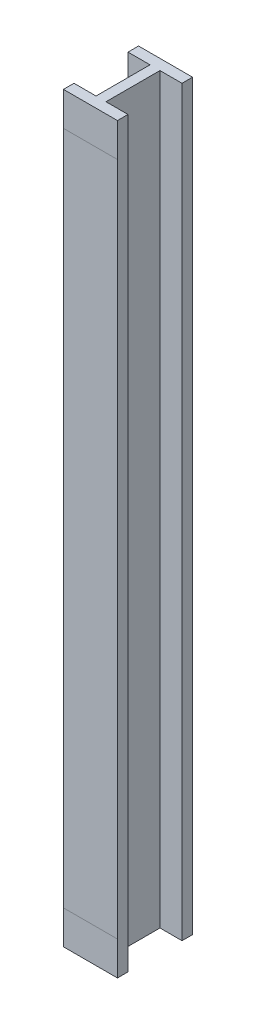
ISO-10303-21;
HEADER;
FILE_DESCRIPTION(('STEP AP214'),'2;1');
FILE_NAME('part.step','',(''),(''),'','','');
FILE_SCHEMA(('AUTOMOTIVE_DESIGN { 1 0 10303 214 1 1 1 1 }'));
ENDSEC;
DATA;
#1=APPLICATION_CONTEXT('core data for automotive mechanical design processes');
#2=APPLICATION_PROTOCOL_DEFINITION('international standard','automotive_design',2000,#1);
#3=PRODUCT_CONTEXT('',#1,'mechanical');
#4=PRODUCT('Part','Part','',(#3));
#5=PRODUCT_RELATED_PRODUCT_CATEGORY('part','',(#4));
#6=PRODUCT_DEFINITION_FORMATION('','',#4);
#7=PRODUCT_DEFINITION_CONTEXT('part definition',#1,'design');
#8=PRODUCT_DEFINITION('design','',#6,#7);
#9=PRODUCT_DEFINITION_SHAPE('','',#8);
#10=(LENGTH_UNIT() NAMED_UNIT(*) SI_UNIT(.MILLI.,.METRE.));
#11=(NAMED_UNIT(*) PLANE_ANGLE_UNIT() SI_UNIT($,.RADIAN.));
#12=(NAMED_UNIT(*) SI_UNIT($,.STERADIAN.) SOLID_ANGLE_UNIT());
#13=UNCERTAINTY_MEASURE_WITH_UNIT(LENGTH_MEASURE(1.E-05),#10,'distance_accuracy_value','');
#14=(GEOMETRIC_REPRESENTATION_CONTEXT(3) GLOBAL_UNCERTAINTY_ASSIGNED_CONTEXT((#13)) GLOBAL_UNIT_ASSIGNED_CONTEXT((#10,
#11,#12)) REPRESENTATION_CONTEXT('',''));
#15=CARTESIAN_POINT('',(0.,0.,0.));
#16=DIRECTION('',(0.,0.,1.));
#17=DIRECTION('',(1.,0.,0.));
#18=AXIS2_PLACEMENT_3D('',#15,#16,#17);
#19=CARTESIAN_POINT('',(0.,2200.,0.));
#20=DIRECTION('',(0.,0.,-1.));
#21=DIRECTION('',(-1.,0.,0.));
#22=AXIS2_PLACEMENT_3D('',#19,#20,#21);
#23=PLANE('',#22);
#24=DIRECTION('',(1.,0.,0.));
#25=VECTOR('',#24,1.);
#26=CARTESIAN_POINT('',(0.,100.,0.));
#27=LINE('',#26,#25);
#28=CARTESIAN_POINT('',(-80.,100.,0.));
#29=VERTEX_POINT('',#28);
#30=CARTESIAN_POINT('',(80.,100.,0.));
#31=VERTEX_POINT('',#30);
#32=EDGE_CURVE('E12',#29,#31,#27,.T.);
#33=ORIENTED_EDGE('',*,*,#32,.F.);
#34=DIRECTION('',(0.,-1.,0.));
#35=VECTOR('',#34,1.);
#36=CARTESIAN_POINT('',(-80.,2200.,0.));
#37=LINE('',#36,#35);
#38=CARTESIAN_POINT('',(-80.,0.,0.));
#39=VERTEX_POINT('',#38);
#40=EDGE_CURVE('E215',#29,#39,#37,.T.);
#41=ORIENTED_EDGE('',*,*,#40,.T.);
#42=DIRECTION('',(1.,0.,0.));
#43=VECTOR('',#42,1.);
#44=CARTESIAN_POINT('',(0.,0.,0.));
#45=LINE('',#44,#43);
#46=CARTESIAN_POINT('',(80.,0.,0.));
#47=VERTEX_POINT('',#46);
#48=EDGE_CURVE('E216',#39,#47,#45,.T.);
#49=ORIENTED_EDGE('',*,*,#48,.T.);
#50=DIRECTION('',(0.,-1.,0.));
#51=VECTOR('',#50,1.);
#52=CARTESIAN_POINT('',(80.,2200.,0.));
#53=LINE('',#52,#51);
#54=EDGE_CURVE('E176',#31,#47,#53,.T.);
#55=ORIENTED_EDGE('',*,*,#54,.F.);
#56=EDGE_LOOP('',(#33,#41,#49,#55));
#57=FACE_BOUND('',#56,.T.);
#58=ADVANCED_FACE('F53',(#57),#23,.F.);
#59=CARTESIAN_POINT('',(-80.,2100.,0.));
#60=VERTEX_POINT('',#59);
#61=EDGE_CURVE('E269',#60,#29,#37,.T.);
#62=ORIENTED_EDGE('',*,*,#61,.T.);
#63=ORIENTED_EDGE('',*,*,#32,.T.);
#64=CARTESIAN_POINT('',(80.,2100.,0.));
#65=VERTEX_POINT('',#64);
#66=EDGE_CURVE('E174',#65,#31,#53,.T.);
#67=ORIENTED_EDGE('',*,*,#66,.F.);
#68=DIRECTION('',(1.,0.,0.));
#69=VECTOR('',#68,1.);
#70=CARTESIAN_POINT('',(0.,2100.,0.));
#71=LINE('',#70,#69);
#72=EDGE_CURVE('E63',#60,#65,#71,.T.);
#73=ORIENTED_EDGE('',*,*,#72,.F.);
#74=EDGE_LOOP('',(#62,#63,#67,#73));
#75=FACE_BOUND('',#74,.T.);
#76=ADVANCED_FACE('F267',(#75),#23,.F.);
#77=CARTESIAN_POINT('',(-80.,2200.,0.));
#78=VERTEX_POINT('',#77);
#79=EDGE_CURVE('E274',#78,#60,#37,.T.);
#80=ORIENTED_EDGE('',*,*,#79,.T.);
#81=ORIENTED_EDGE('',*,*,#72,.T.);
#82=CARTESIAN_POINT('',(80.,2200.,0.));
#83=VERTEX_POINT('',#82);
#84=EDGE_CURVE('E170',#83,#65,#53,.T.);
#85=ORIENTED_EDGE('',*,*,#84,.F.);
#86=DIRECTION('',(1.,0.,0.));
#87=VECTOR('',#86,1.);
#88=CARTESIAN_POINT('',(-80.,2200.,0.));
#89=LINE('',#88,#87);
#90=EDGE_CURVE('E155',#78,#83,#89,.T.);
#91=ORIENTED_EDGE('',*,*,#90,.F.);
#92=EDGE_LOOP('',(#80,#81,#85,#91));
#93=FACE_BOUND('',#92,.T.);
#94=ADVANCED_FACE('F55',(#93),#23,.F.);
#95=CARTESIAN_POINT('',(80.,2200.,0.));
#96=DIRECTION('',(-1.,0.,0.));
#97=DIRECTION('',(0.,0.,1.));
#98=AXIS2_PLACEMENT_3D('',#95,#96,#97);
#99=PLANE('',#98);
#100=DIRECTION('',(0.,0.,-1.));
#101=VECTOR('',#100,1.);
#102=CARTESIAN_POINT('',(80.,0.,0.));
#103=LINE('',#102,#101);
#104=CARTESIAN_POINT('',(80.,0.,-31.25));
#105=VERTEX_POINT('',#104);
#106=EDGE_CURVE('E291',#47,#105,#103,.T.);
#107=ORIENTED_EDGE('',*,*,#106,.T.);
#108=DIRECTION('',(0.,-1.,0.));
#109=VECTOR('',#108,1.);
#110=CARTESIAN_POINT('',(80.,2200.,-31.25));
#111=LINE('',#110,#109);
#112=CARTESIAN_POINT('',(80.,2200.,-31.25));
#113=VERTEX_POINT('',#112);
#114=EDGE_CURVE('E179',#113,#105,#111,.T.);
#115=ORIENTED_EDGE('',*,*,#114,.F.);
#116=DIRECTION('',(0.,0.,-1.));
#117=VECTOR('',#116,1.);
#118=CARTESIAN_POINT('',(80.,2200.,0.));
#119=LINE('',#118,#117);
#120=EDGE_CURVE('E159',#83,#113,#119,.T.);
#121=ORIENTED_EDGE('',*,*,#120,.F.);
#122=ORIENTED_EDGE('',*,*,#84,.T.);
#123=ORIENTED_EDGE('',*,*,#66,.T.);
#124=ORIENTED_EDGE('',*,*,#54,.T.);
#125=EDGE_LOOP('',(#107,#115,#121,#122,#123,#124));
#126=FACE_BOUND('',#125,.T.);
#127=ADVANCED_FACE('F177',(#126),#99,.F.);
#128=CARTESIAN_POINT('',(80.,2200.,-31.25));
#129=DIRECTION('',(0.,0.,1.));
#130=DIRECTION('',(1.,0.,0.));
#131=AXIS2_PLACEMENT_3D('',#128,#129,#130);
#132=PLANE('',#131);
#133=DIRECTION('',(-1.,0.,0.));
#134=VECTOR('',#133,1.);
#135=CARTESIAN_POINT('',(80.,0.,-31.25));
#136=LINE('',#135,#134);
#137=CARTESIAN_POINT('',(14.7486033519554,0.,-31.25));
#138=VERTEX_POINT('',#137);
#139=EDGE_CURVE('E321',#105,#138,#136,.T.);
#140=ORIENTED_EDGE('',*,*,#139,.T.);
#141=DIRECTION('',(0.,-1.,0.));
#142=VECTOR('',#141,1.);
#143=CARTESIAN_POINT('',(14.7486033519554,2200.,-31.25));
#144=LINE('',#143,#142);
#145=CARTESIAN_POINT('',(14.7486033519554,2200.,-31.25));
#146=VERTEX_POINT('',#145);
#147=EDGE_CURVE('E254',#146,#138,#144,.T.);
#148=ORIENTED_EDGE('',*,*,#147,.F.);
#149=DIRECTION('',(-1.,0.,0.));
#150=VECTOR('',#149,1.);
#151=CARTESIAN_POINT('',(80.,2200.,-31.25));
#152=LINE('',#151,#150);
#153=EDGE_CURVE('E182',#113,#146,#152,.T.);
#154=ORIENTED_EDGE('',*,*,#153,.F.);
#155=ORIENTED_EDGE('',*,*,#114,.T.);
#156=EDGE_LOOP('',(#140,#148,#154,#155));
#157=FACE_BOUND('',#156,.T.);
#158=ADVANCED_FACE('F324',(#157),#132,.F.);
#159=CARTESIAN_POINT('',(14.7486033519554,2200.,-31.25));
#160=DIRECTION('',(-1.,0.,0.));
#161=DIRECTION('',(0.,0.,1.));
#162=AXIS2_PLACEMENT_3D('',#159,#160,#161);
#163=PLANE('',#162);
#164=DIRECTION('',(0.,0.,-1.));
#165=VECTOR('',#164,1.);
#166=CARTESIAN_POINT('',(14.7486033519554,0.,-31.25));
#167=LINE('',#166,#165);
#168=CARTESIAN_POINT('',(14.7486033519554,0.,-191.25));
#169=VERTEX_POINT('',#168);
#170=EDGE_CURVE('E318',#138,#169,#167,.T.);
#171=ORIENTED_EDGE('',*,*,#170,.T.);
#172=DIRECTION('',(0.,-1.,0.));
#173=VECTOR('',#172,1.);
#174=CARTESIAN_POINT('',(14.7486033519554,2200.,-191.25));
#175=LINE('',#174,#173);
#176=CARTESIAN_POINT('',(14.7486033519554,2200.,-191.25));
#177=VERTEX_POINT('',#176);
#178=EDGE_CURVE('E251',#177,#169,#175,.T.);
#179=ORIENTED_EDGE('',*,*,#178,.F.);
#180=DIRECTION('',(0.,0.,-1.));
#181=VECTOR('',#180,1.);
#182=CARTESIAN_POINT('',(14.7486033519554,2200.,-31.25));
#183=LINE('',#182,#181);
#184=EDGE_CURVE('E185',#146,#177,#183,.T.);
#185=ORIENTED_EDGE('',*,*,#184,.F.);
#186=ORIENTED_EDGE('',*,*,#147,.T.);
#187=EDGE_LOOP('',(#171,#179,#185,#186));
#188=FACE_BOUND('',#187,.T.);
#189=ADVANCED_FACE('F328',(#188),#163,.F.);
#190=CARTESIAN_POINT('',(14.7486033519554,2200.,-191.25));
#191=DIRECTION('',(0.,0.,-1.));
#192=DIRECTION('',(-1.,0.,0.));
#193=AXIS2_PLACEMENT_3D('',#190,#191,#192);
#194=PLANE('',#193);
#195=DIRECTION('',(1.,0.,0.));
#196=VECTOR('',#195,1.);
#197=CARTESIAN_POINT('',(14.7486033519554,0.,-191.25));
#198=LINE('',#197,#196);
#199=CARTESIAN_POINT('',(80.,0.,-191.25));
#200=VERTEX_POINT('',#199);
#201=EDGE_CURVE('E315',#169,#200,#198,.T.);
#202=ORIENTED_EDGE('',*,*,#201,.T.);
#203=DIRECTION('',(0.,-1.,0.));
#204=VECTOR('',#203,1.);
#205=CARTESIAN_POINT('',(80.,2200.,-191.25));
#206=LINE('',#205,#204);
#207=CARTESIAN_POINT('',(80.,2200.,-191.25));
#208=VERTEX_POINT('',#207);
#209=EDGE_CURVE('E247',#208,#200,#206,.T.);
#210=ORIENTED_EDGE('',*,*,#209,.F.);
#211=DIRECTION('',(1.,0.,0.));
#212=VECTOR('',#211,1.);
#213=CARTESIAN_POINT('',(14.7486033519554,2200.,-191.25));
#214=LINE('',#213,#212);
#215=EDGE_CURVE('E191',#177,#208,#214,.T.);
#216=ORIENTED_EDGE('',*,*,#215,.F.);
#217=ORIENTED_EDGE('',*,*,#178,.T.);
#218=EDGE_LOOP('',(#202,#210,#216,#217));
#219=FACE_BOUND('',#218,.T.);
#220=ADVANCED_FACE('F331',(#219),#194,.F.);
#221=CARTESIAN_POINT('',(80.,2200.,-191.25));
#222=DIRECTION('',(-1.,0.,0.));
#223=DIRECTION('',(0.,0.,1.));
#224=AXIS2_PLACEMENT_3D('',#221,#222,#223);
#225=PLANE('',#224);
#226=DIRECTION('',(0.,0.,-1.));
#227=VECTOR('',#226,1.);
#228=CARTESIAN_POINT('',(80.,0.,-191.25));
#229=LINE('',#228,#227);
#230=CARTESIAN_POINT('',(80.,0.,-222.5));
#231=VERTEX_POINT('',#230);
#232=EDGE_CURVE('E312',#200,#231,#229,.T.);
#233=ORIENTED_EDGE('',*,*,#232,.T.);
#234=DIRECTION('',(0.,-1.,0.));
#235=VECTOR('',#234,1.);
#236=CARTESIAN_POINT('',(80.,2200.,-222.5));
#237=LINE('',#236,#235);
#238=CARTESIAN_POINT('',(80.,2200.,-222.5));
#239=VERTEX_POINT('',#238);
#240=EDGE_CURVE('E241',#239,#231,#237,.T.);
#241=ORIENTED_EDGE('',*,*,#240,.F.);
#242=DIRECTION('',(0.,0.,-1.));
#243=VECTOR('',#242,1.);
#244=CARTESIAN_POINT('',(80.,2200.,-191.25));
#245=LINE('',#244,#243);
#246=EDGE_CURVE('E194',#208,#239,#245,.T.);
#247=ORIENTED_EDGE('',*,*,#246,.F.);
#248=ORIENTED_EDGE('',*,*,#209,.T.);
#249=EDGE_LOOP('',(#233,#241,#247,#248));
#250=FACE_BOUND('',#249,.T.);
#251=ADVANCED_FACE('F338',(#250),#225,.F.);
#252=CARTESIAN_POINT('',(80.,2200.,-222.5));
#253=DIRECTION('',(0.,0.,1.));
#254=DIRECTION('',(1.,0.,0.));
#255=AXIS2_PLACEMENT_3D('',#252,#253,#254);
#256=PLANE('',#255);
#257=DIRECTION('',(-1.,0.,0.));
#258=VECTOR('',#257,1.);
#259=CARTESIAN_POINT('',(80.,0.,-222.5));
#260=LINE('',#259,#258);
#261=CARTESIAN_POINT('',(-80.,0.,-222.5));
#262=VERTEX_POINT('',#261);
#263=EDGE_CURVE('E309',#231,#262,#260,.T.);
#264=ORIENTED_EDGE('',*,*,#263,.T.);
#265=DIRECTION('',(0.,-1.,0.));
#266=VECTOR('',#265,1.);
#267=CARTESIAN_POINT('',(-80.,2200.,-222.5));
#268=LINE('',#267,#266);
#269=CARTESIAN_POINT('',(-80.,2200.,-222.5));
#270=VERTEX_POINT('',#269);
#271=EDGE_CURVE('E236',#270,#262,#268,.T.);
#272=ORIENTED_EDGE('',*,*,#271,.F.);
#273=DIRECTION('',(-1.,0.,0.));
#274=VECTOR('',#273,1.);
#275=CARTESIAN_POINT('',(80.,2200.,-222.5));
#276=LINE('',#275,#274);
#277=EDGE_CURVE('E197',#239,#270,#276,.T.);
#278=ORIENTED_EDGE('',*,*,#277,.F.);
#279=ORIENTED_EDGE('',*,*,#240,.T.);
#280=EDGE_LOOP('',(#264,#272,#278,#279));
#281=FACE_BOUND('',#280,.T.);
#282=ADVANCED_FACE('F341',(#281),#256,.F.);
#283=CARTESIAN_POINT('',(-80.,2200.,-222.5));
#284=DIRECTION('',(1.,0.,0.));
#285=DIRECTION('',(0.,0.,-1.));
#286=AXIS2_PLACEMENT_3D('',#283,#284,#285);
#287=PLANE('',#286);
#288=DIRECTION('',(0.,0.,1.));
#289=VECTOR('',#288,1.);
#290=CARTESIAN_POINT('',(-80.,0.,-222.5));
#291=LINE('',#290,#289);
#292=CARTESIAN_POINT('',(-80.,0.,-191.25));
#293=VERTEX_POINT('',#292);
#294=EDGE_CURVE('E306',#262,#293,#291,.T.);
#295=ORIENTED_EDGE('',*,*,#294,.T.);
#296=DIRECTION('',(0.,-1.,0.));
#297=VECTOR('',#296,1.);
#298=CARTESIAN_POINT('',(-80.,2200.,-191.25));
#299=LINE('',#298,#297);
#300=CARTESIAN_POINT('',(-80.,2200.,-191.25));
#301=VERTEX_POINT('',#300);
#302=EDGE_CURVE('E242',#301,#293,#299,.T.);
#303=ORIENTED_EDGE('',*,*,#302,.F.);
#304=DIRECTION('',(0.,0.,1.));
#305=VECTOR('',#304,1.);
#306=CARTESIAN_POINT('',(-80.,2200.,-222.5));
#307=LINE('',#306,#305);
#308=EDGE_CURVE('E200',#270,#301,#307,.T.);
#309=ORIENTED_EDGE('',*,*,#308,.F.);
#310=ORIENTED_EDGE('',*,*,#271,.T.);
#311=EDGE_LOOP('',(#295,#303,#309,#310));
#312=FACE_BOUND('',#311,.T.);
#313=ADVANCED_FACE('F346',(#312),#287,.F.);
#314=CARTESIAN_POINT('',(-80.,2200.,-191.25));
#315=DIRECTION('',(0.,0.,-1.));
#316=DIRECTION('',(-1.,0.,0.));
#317=AXIS2_PLACEMENT_3D('',#314,#315,#316);
#318=PLANE('',#317);
#319=DIRECTION('',(1.,0.,0.));
#320=VECTOR('',#319,1.);
#321=CARTESIAN_POINT('',(-80.,0.,-191.25));
#322=LINE('',#321,#320);
#323=CARTESIAN_POINT('',(-14.7486033519554,0.,-191.25));
#324=VERTEX_POINT('',#323);
#325=EDGE_CURVE('E303',#293,#324,#322,.T.);
#326=ORIENTED_EDGE('',*,*,#325,.T.);
#327=DIRECTION('',(0.,-1.,0.));
#328=VECTOR('',#327,1.);
#329=CARTESIAN_POINT('',(-14.7486033519554,2200.,-191.25));
#330=LINE('',#329,#328);
#331=CARTESIAN_POINT('',(-14.7486033519554,2200.,-191.25));
#332=VERTEX_POINT('',#331);
#333=EDGE_CURVE('E354',#332,#324,#330,.T.);
#334=ORIENTED_EDGE('',*,*,#333,.F.);
#335=DIRECTION('',(1.,0.,0.));
#336=VECTOR('',#335,1.);
#337=CARTESIAN_POINT('',(-80.,2200.,-191.25));
#338=LINE('',#337,#336);
#339=EDGE_CURVE('E203',#301,#332,#338,.T.);
#340=ORIENTED_EDGE('',*,*,#339,.F.);
#341=ORIENTED_EDGE('',*,*,#302,.T.);
#342=EDGE_LOOP('',(#326,#334,#340,#341));
#343=FACE_BOUND('',#342,.T.);
#344=ADVANCED_FACE('F355',(#343),#318,.F.);
#345=CARTESIAN_POINT('',(-14.7486033519554,2200.,-191.25));
#346=DIRECTION('',(1.,0.,0.));
#347=DIRECTION('',(0.,0.,-1.));
#348=AXIS2_PLACEMENT_3D('',#345,#346,#347);
#349=PLANE('',#348);
#350=DIRECTION('',(0.,0.,1.));
#351=VECTOR('',#350,1.);
#352=CARTESIAN_POINT('',(-14.7486033519554,0.,-191.25));
#353=LINE('',#352,#351);
#354=CARTESIAN_POINT('',(-14.7486033519554,0.,-31.25));
#355=VERTEX_POINT('',#354);
#356=EDGE_CURVE('E297',#324,#355,#353,.T.);
#357=ORIENTED_EDGE('',*,*,#356,.T.);
#358=DIRECTION('',(0.,-1.,0.));
#359=VECTOR('',#358,1.);
#360=CARTESIAN_POINT('',(-14.7486033519554,2200.,-31.25));
#361=LINE('',#360,#359);
#362=CARTESIAN_POINT('',(-14.7486033519554,2200.,-31.25));
#363=VERTEX_POINT('',#362);
#364=EDGE_CURVE('E281',#363,#355,#361,.T.);
#365=ORIENTED_EDGE('',*,*,#364,.F.);
#366=DIRECTION('',(0.,0.,1.));
#367=VECTOR('',#366,1.);
#368=CARTESIAN_POINT('',(-14.7486033519554,2200.,-191.25));
#369=LINE('',#368,#367);
#370=EDGE_CURVE('E206',#332,#363,#369,.T.);
#371=ORIENTED_EDGE('',*,*,#370,.F.);
#372=ORIENTED_EDGE('',*,*,#333,.T.);
#373=EDGE_LOOP('',(#357,#365,#371,#372));
#374=FACE_BOUND('',#373,.T.);
#375=ADVANCED_FACE('F360',(#374),#349,.F.);
#376=CARTESIAN_POINT('',(-14.7486033519554,2200.,-31.25));
#377=DIRECTION('',(0.,0.,1.));
#378=DIRECTION('',(1.,0.,0.));
#379=AXIS2_PLACEMENT_3D('',#376,#377,#378);
#380=PLANE('',#379);
#381=DIRECTION('',(-1.,0.,0.));
#382=VECTOR('',#381,1.);
#383=CARTESIAN_POINT('',(-14.7486033519554,0.,-31.25));
#384=LINE('',#383,#382);
#385=CARTESIAN_POINT('',(-80.,0.,-31.25));
#386=VERTEX_POINT('',#385);
#387=EDGE_CURVE('E295',#355,#386,#384,.T.);
#388=ORIENTED_EDGE('',*,*,#387,.T.);
#389=DIRECTION('',(0.,-1.,0.));
#390=VECTOR('',#389,1.);
#391=CARTESIAN_POINT('',(-80.,2200.,-31.25));
#392=LINE('',#391,#390);
#393=CARTESIAN_POINT('',(-80.,2200.,-31.25));
#394=VERTEX_POINT('',#393);
#395=EDGE_CURVE('E278',#394,#386,#392,.T.);
#396=ORIENTED_EDGE('',*,*,#395,.F.);
#397=DIRECTION('',(-1.,0.,0.));
#398=VECTOR('',#397,1.);
#399=CARTESIAN_POINT('',(-14.7486033519554,2200.,-31.25));
#400=LINE('',#399,#398);
#401=EDGE_CURVE('E209',#363,#394,#400,.T.);
#402=ORIENTED_EDGE('',*,*,#401,.F.);
#403=ORIENTED_EDGE('',*,*,#364,.T.);
#404=EDGE_LOOP('',(#388,#396,#402,#403));
#405=FACE_BOUND('',#404,.T.);
#406=ADVANCED_FACE('F366',(#405),#380,.F.);
#407=CARTESIAN_POINT('',(-80.,2200.,-31.25));
#408=DIRECTION('',(1.,0.,0.));
#409=DIRECTION('',(0.,0.,-1.));
#410=AXIS2_PLACEMENT_3D('',#407,#408,#409);
#411=PLANE('',#410);
#412=DIRECTION('',(0.,0.,1.));
#413=VECTOR('',#412,1.);
#414=CARTESIAN_POINT('',(-80.,0.,-31.25));
#415=LINE('',#414,#413);
#416=EDGE_CURVE('E167',#386,#39,#415,.T.);
#417=ORIENTED_EDGE('',*,*,#416,.T.);
#418=ORIENTED_EDGE('',*,*,#40,.F.);
#419=ORIENTED_EDGE('',*,*,#61,.F.);
#420=ORIENTED_EDGE('',*,*,#79,.F.);
#421=DIRECTION('',(0.,0.,1.));
#422=VECTOR('',#421,1.);
#423=CARTESIAN_POINT('',(-80.,2200.,-31.25));
#424=LINE('',#423,#422);
#425=EDGE_CURVE('E162',#394,#78,#424,.T.);
#426=ORIENTED_EDGE('',*,*,#425,.F.);
#427=ORIENTED_EDGE('',*,*,#395,.T.);
#428=EDGE_LOOP('',(#417,#418,#419,#420,#426,#427));
#429=FACE_BOUND('',#428,.T.);
#430=ADVANCED_FACE('F273',(#429),#411,.F.);
#431=CARTESIAN_POINT('',(0.,2200.,0.));
#432=DIRECTION('',(0.,1.,0.));
#433=DIRECTION('',(0.,0.,1.));
#434=AXIS2_PLACEMENT_3D('',#431,#432,#433);
#435=PLANE('',#434);
#436=ORIENTED_EDGE('',*,*,#90,.T.);
#437=ORIENTED_EDGE('',*,*,#120,.T.);
#438=ORIENTED_EDGE('',*,*,#153,.T.);
#439=ORIENTED_EDGE('',*,*,#184,.T.);
#440=ORIENTED_EDGE('',*,*,#215,.T.);
#441=ORIENTED_EDGE('',*,*,#246,.T.);
#442=ORIENTED_EDGE('',*,*,#277,.T.);
#443=ORIENTED_EDGE('',*,*,#308,.T.);
#444=ORIENTED_EDGE('',*,*,#339,.T.);
#445=ORIENTED_EDGE('',*,*,#370,.T.);
#446=ORIENTED_EDGE('',*,*,#401,.T.);
#447=ORIENTED_EDGE('',*,*,#425,.T.);
#448=EDGE_LOOP('',(#436,#437,#438,#439,#440,#441,#442,#443,#444,#445,#446,#447));
#449=FACE_BOUND('',#448,.T.);
#450=ADVANCED_FACE('F157',(#449),#435,.T.);
#451=CARTESIAN_POINT('',(0.,0.,0.));
#452=DIRECTION('',(0.,1.,0.));
#453=DIRECTION('',(0.,0.,1.));
#454=AXIS2_PLACEMENT_3D('',#451,#452,#453);
#455=PLANE('',#454);
#456=ORIENTED_EDGE('',*,*,#48,.F.);
#457=ORIENTED_EDGE('',*,*,#416,.F.);
#458=ORIENTED_EDGE('',*,*,#387,.F.);
#459=ORIENTED_EDGE('',*,*,#356,.F.);
#460=ORIENTED_EDGE('',*,*,#325,.F.);
#461=ORIENTED_EDGE('',*,*,#294,.F.);
#462=ORIENTED_EDGE('',*,*,#263,.F.);
#463=ORIENTED_EDGE('',*,*,#232,.F.);
#464=ORIENTED_EDGE('',*,*,#201,.F.);
#465=ORIENTED_EDGE('',*,*,#170,.F.);
#466=ORIENTED_EDGE('',*,*,#139,.F.);
#467=ORIENTED_EDGE('',*,*,#106,.F.);
#468=EDGE_LOOP('',(#456,#457,#458,#459,#460,#461,#462,#463,#464,#465,#466,#467));
#469=FACE_BOUND('',#468,.T.);
#470=ADVANCED_FACE('F289',(#469),#455,.F.);
#471=CLOSED_SHELL('',(#58,#76,#94,#127,#158,#189,#220,#251,#282,#313,#344,#375,#406,#430,#450,#470));
#472=MANIFOLD_SOLID_BREP('B2',#471);
#473=ADVANCED_BREP_SHAPE_REPRESENTATION('',(#18,#472),#14);
#474=SHAPE_DEFINITION_REPRESENTATION(#9,#473);
ENDSEC;
END-ISO-10303-21;
